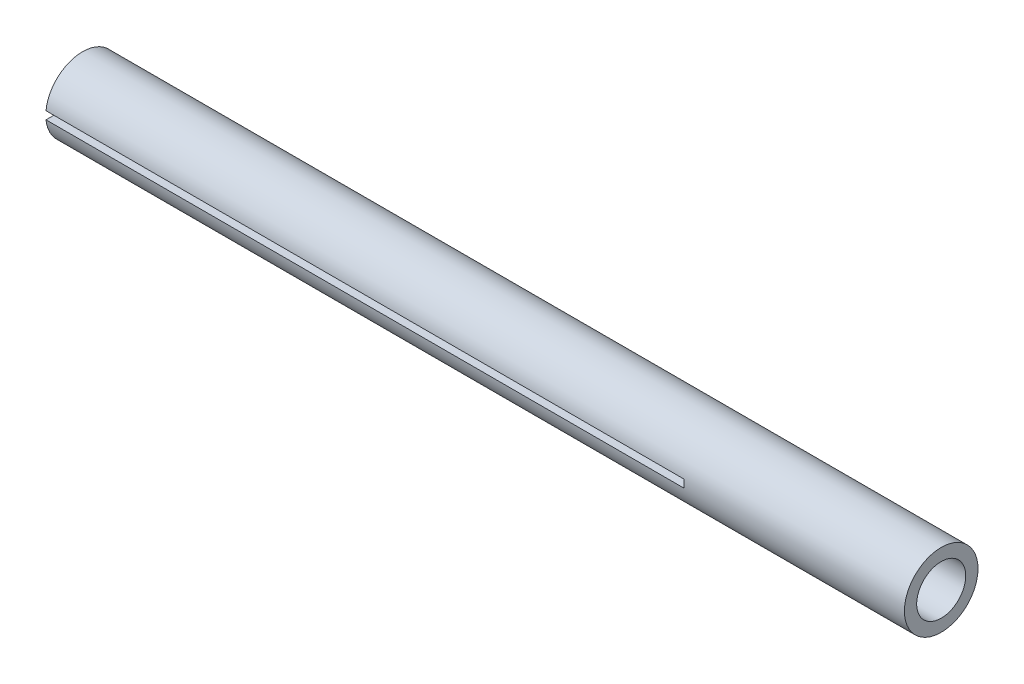
ISO-10303-21;
HEADER;
FILE_DESCRIPTION(('STEP AP214'),'2;1');
FILE_NAME('part.step','',(''),(''),'','','');
FILE_SCHEMA(('AUTOMOTIVE_DESIGN { 1 0 10303 214 1 1 1 1 }'));
ENDSEC;
DATA;
#1=APPLICATION_CONTEXT('core data for automotive mechanical design processes');
#2=APPLICATION_PROTOCOL_DEFINITION('international standard','automotive_design',2000,#1);
#3=PRODUCT_CONTEXT('',#1,'mechanical');
#4=PRODUCT('Part','Part','',(#3));
#5=PRODUCT_RELATED_PRODUCT_CATEGORY('part','',(#4));
#6=PRODUCT_DEFINITION_FORMATION('','',#4);
#7=PRODUCT_DEFINITION_CONTEXT('part definition',#1,'design');
#8=PRODUCT_DEFINITION('design','',#6,#7);
#9=PRODUCT_DEFINITION_SHAPE('','',#8);
#10=(LENGTH_UNIT() NAMED_UNIT(*) SI_UNIT(.MILLI.,.METRE.));
#11=(NAMED_UNIT(*) PLANE_ANGLE_UNIT() SI_UNIT($,.RADIAN.));
#12=(NAMED_UNIT(*) SI_UNIT($,.STERADIAN.) SOLID_ANGLE_UNIT());
#13=UNCERTAINTY_MEASURE_WITH_UNIT(LENGTH_MEASURE(1.E-05),#10,'distance_accuracy_value','');
#14=(GEOMETRIC_REPRESENTATION_CONTEXT(3) GLOBAL_UNCERTAINTY_ASSIGNED_CONTEXT((#13)) GLOBAL_UNIT_ASSIGNED_CONTEXT((#10,
#11,#12)) REPRESENTATION_CONTEXT('',''));
#15=CARTESIAN_POINT('',(0.,0.,0.));
#16=DIRECTION('',(0.,0.,1.));
#17=DIRECTION('',(1.,0.,0.));
#18=AXIS2_PLACEMENT_3D('',#15,#16,#17);
#19=CARTESIAN_POINT('',(0.,15.0494836321337,37.2907559026321));
#20=DIRECTION('',(1.,0.,0.));
#21=DIRECTION('',(0.,0.,-1.));
#22=AXIS2_PLACEMENT_3D('',#19,#20,#21);
#23=PLANE('',#22);
#24=DIRECTION('',(0.,0.,-1.));
#25=VECTOR('',#24,1.);
#26=CARTESIAN_POINT('',(0.,14.8462836321337,47.5777559026321));
#27=LINE('',#26,#25);
#28=CARTESIAN_POINT('',(0.,14.8462836321337,36.03711729442));
#29=VERTEX_POINT('',#28);
#30=CARTESIAN_POINT('',(0.,14.8462836321337,35.3966242387819));
#31=VERTEX_POINT('',#30);
#32=EDGE_CURVE('E152',#29,#31,#27,.T.);
#33=ORIENTED_EDGE('',*,*,#32,.T.);
#34=CARTESIAN_POINT('',(0.,15.0494836321337,37.2907559026321));
#35=DIRECTION('',(1.,0.,0.));
#36=DIRECTION('',(0.,0.,-1.));
#37=AXIS2_PLACEMENT_3D('',#34,#35,#36);
#38=CIRCLE('',#37,1.90500000000001);
#39=CARTESIAN_POINT('',(0.,14.8462836321337,39.1848875664824));
#40=VERTEX_POINT('',#39);
#41=EDGE_CURVE('E122',#40,#31,#38,.T.);
#42=ORIENTED_EDGE('',*,*,#41,.F.);
#43=CARTESIAN_POINT('',(0.,14.8462836321337,38.5443945108442));
#44=VERTEX_POINT('',#43);
#45=EDGE_CURVE('E156',#40,#44,#27,.T.);
#46=ORIENTED_EDGE('',*,*,#45,.T.);
#47=CARTESIAN_POINT('',(0.,15.0494836321337,37.2907559026321));
#48=DIRECTION('',(1.,0.,0.));
#49=DIRECTION('',(0.,0.,-1.));
#50=AXIS2_PLACEMENT_3D('',#47,#48,#49);
#51=CIRCLE('',#50,1.27);
#52=EDGE_CURVE('E167',#44,#29,#51,.T.);
#53=ORIENTED_EDGE('',*,*,#52,.T.);
#54=EDGE_LOOP('',(#33,#42,#46,#53));
#55=FACE_BOUND('',#54,.T.);
#56=ADVANCED_FACE('F34',(#55),#23,.F.);
#57=DIRECTION('',(0.,0.,-1.));
#58=VECTOR('',#57,1.);
#59=CARTESIAN_POINT('',(0.,15.2526836321337,47.5777559026321));
#60=LINE('',#59,#58);
#61=CARTESIAN_POINT('',(0.,15.2526836321337,39.1848875664824));
#62=VERTEX_POINT('',#61);
#63=CARTESIAN_POINT('',(0.,15.2526836321337,38.5443945108442));
#64=VERTEX_POINT('',#63);
#65=EDGE_CURVE('E57',#62,#64,#60,.T.);
#66=ORIENTED_EDGE('',*,*,#65,.F.);
#67=CARTESIAN_POINT('',(0.,15.2526836321337,35.3966242387819));
#68=VERTEX_POINT('',#67);
#69=EDGE_CURVE('E113',#68,#62,#38,.T.);
#70=ORIENTED_EDGE('',*,*,#69,.F.);
#71=CARTESIAN_POINT('',(0.,15.2526836321337,36.03711729442));
#72=VERTEX_POINT('',#71);
#73=EDGE_CURVE('E116',#72,#68,#60,.T.);
#74=ORIENTED_EDGE('',*,*,#73,.F.);
#75=EDGE_CURVE('E115',#72,#64,#51,.T.);
#76=ORIENTED_EDGE('',*,*,#75,.T.);
#77=EDGE_LOOP('',(#66,#70,#74,#76));
#78=FACE_BOUND('',#77,.T.);
#79=ADVANCED_FACE('F111',(#78),#23,.F.);
#80=CARTESIAN_POINT('',(44.45,15.0494836321337,37.2907559026321));
#81=DIRECTION('',(-1.,0.,0.));
#82=DIRECTION('',(0.,0.,1.));
#83=AXIS2_PLACEMENT_3D('',#80,#81,#82);
#84=CYLINDRICAL_SURFACE('',#83,1.90500000000001);
#85=CARTESIAN_POINT('',(44.45,15.0494836321337,37.2907559026321));
#86=DIRECTION('',(1.,0.,0.));
#87=DIRECTION('',(0.,0.,-1.));
#88=AXIS2_PLACEMENT_3D('',#85,#86,#87);
#89=CIRCLE('',#88,1.90500000000001);
#90=CARTESIAN_POINT('',(44.45,15.0494836321337,35.3857559026321));
#91=VERTEX_POINT('',#90);
#92=EDGE_CURVE('E121',#91,#91,#89,.T.);
#93=ORIENTED_EDGE('',*,*,#92,.F.);
#94=EDGE_LOOP('',(#93));
#95=FACE_BOUND('',#94,.T.);
#96=DIRECTION('',(-1.,0.,0.));
#97=VECTOR('',#96,1.);
#98=CARTESIAN_POINT('',(44.45,14.8462836321337,39.1848875664824));
#99=LINE('',#98,#97);
#100=CARTESIAN_POINT('',(33.0324608621808,14.8462836321337,39.1848875664824));
#101=VERTEX_POINT('',#100);
#102=EDGE_CURVE('E151',#40,#101,#99,.F.);
#103=ORIENTED_EDGE('',*,*,#102,.F.);
#104=ORIENTED_EDGE('',*,*,#41,.T.);
#105=DIRECTION('',(-1.,0.,0.));
#106=VECTOR('',#105,1.);
#107=CARTESIAN_POINT('',(44.45,14.8462836321337,35.3966242387819));
#108=LINE('',#107,#106);
#109=CARTESIAN_POINT('',(33.0324608621808,14.8462836321337,35.3966242387819));
#110=VERTEX_POINT('',#109);
#111=EDGE_CURVE('E165',#110,#31,#108,.T.);
#112=ORIENTED_EDGE('',*,*,#111,.F.);
#113=CARTESIAN_POINT('',(33.0324608621808,15.0494836321337,37.2907559026321));
#114=DIRECTION('',(-1.,0.,0.));
#115=DIRECTION('',(0.,0.,1.));
#116=AXIS2_PLACEMENT_3D('',#113,#114,#115);
#117=CIRCLE('',#116,1.90500000000001);
#118=CARTESIAN_POINT('',(33.0324608621808,15.2526836321337,35.3966242387819));
#119=VERTEX_POINT('',#118);
#120=EDGE_CURVE('E163',#119,#110,#117,.T.);
#121=ORIENTED_EDGE('',*,*,#120,.F.);
#122=DIRECTION('',(-1.,0.,0.));
#123=VECTOR('',#122,1.);
#124=CARTESIAN_POINT('',(44.45,15.2526836321337,35.3966242387819));
#125=LINE('',#124,#123);
#126=EDGE_CURVE('E106',#68,#119,#125,.F.);
#127=ORIENTED_EDGE('',*,*,#126,.F.);
#128=ORIENTED_EDGE('',*,*,#69,.T.);
#129=DIRECTION('',(-1.,0.,0.));
#130=VECTOR('',#129,1.);
#131=CARTESIAN_POINT('',(44.45,15.2526836321337,39.1848875664824));
#132=LINE('',#131,#130);
#133=CARTESIAN_POINT('',(33.0324608621808,15.2526836321337,39.1848875664824));
#134=VERTEX_POINT('',#133);
#135=EDGE_CURVE('E98',#134,#62,#132,.T.);
#136=ORIENTED_EDGE('',*,*,#135,.F.);
#137=EDGE_CURVE('E105',#101,#134,#117,.T.);
#138=ORIENTED_EDGE('',*,*,#137,.F.);
#139=EDGE_LOOP('',(#103,#104,#112,#121,#127,#128,#136,#138));
#140=FACE_BOUND('',#139,.T.);
#141=ADVANCED_FACE('F36',(#95,#140),#84,.T.);
#142=CARTESIAN_POINT('',(44.45,15.0494836321337,37.2907559026321));
#143=DIRECTION('',(-1.,0.,0.));
#144=DIRECTION('',(0.,0.,1.));
#145=AXIS2_PLACEMENT_3D('',#142,#143,#144);
#146=CYLINDRICAL_SURFACE('',#145,1.27);
#147=CARTESIAN_POINT('',(44.45,15.0494836321337,37.2907559026321));
#148=DIRECTION('',(1.,0.,0.));
#149=DIRECTION('',(0.,0.,-1.));
#150=AXIS2_PLACEMENT_3D('',#147,#148,#149);
#151=CIRCLE('',#150,1.27);
#152=CARTESIAN_POINT('',(44.45,15.0494836321337,36.0207559026321));
#153=VERTEX_POINT('',#152);
#154=EDGE_CURVE('E128',#153,#153,#151,.T.);
#155=ORIENTED_EDGE('',*,*,#154,.T.);
#156=EDGE_LOOP('',(#155));
#157=FACE_BOUND('',#156,.T.);
#158=ORIENTED_EDGE('',*,*,#52,.F.);
#159=DIRECTION('',(-1.,0.,0.));
#160=VECTOR('',#159,1.);
#161=CARTESIAN_POINT('',(44.45,14.8462836321337,38.5443945108442));
#162=LINE('',#161,#160);
#163=CARTESIAN_POINT('',(33.0324608621808,14.8462836321337,38.5443945108442));
#164=VERTEX_POINT('',#163);
#165=EDGE_CURVE('E11',#44,#164,#162,.F.);
#166=ORIENTED_EDGE('',*,*,#165,.T.);
#167=CARTESIAN_POINT('',(33.0324608621808,15.0494836321337,37.2907559026321));
#168=DIRECTION('',(-1.,0.,0.));
#169=DIRECTION('',(0.,0.,1.));
#170=AXIS2_PLACEMENT_3D('',#167,#168,#169);
#171=CIRCLE('',#170,1.27);
#172=CARTESIAN_POINT('',(33.0324608621808,15.2526836321337,38.5443945108442));
#173=VERTEX_POINT('',#172);
#174=EDGE_CURVE('E42',#164,#173,#171,.T.);
#175=ORIENTED_EDGE('',*,*,#174,.T.);
#176=DIRECTION('',(-1.,0.,0.));
#177=VECTOR('',#176,1.);
#178=CARTESIAN_POINT('',(44.45,15.2526836321337,38.5443945108442));
#179=LINE('',#178,#177);
#180=EDGE_CURVE('E138',#173,#64,#179,.T.);
#181=ORIENTED_EDGE('',*,*,#180,.T.);
#182=ORIENTED_EDGE('',*,*,#75,.F.);
#183=DIRECTION('',(-1.,0.,0.));
#184=VECTOR('',#183,1.);
#185=CARTESIAN_POINT('',(44.45,15.2526836321337,36.03711729442));
#186=LINE('',#185,#184);
#187=CARTESIAN_POINT('',(33.0324608621808,15.2526836321337,36.03711729442));
#188=VERTEX_POINT('',#187);
#189=EDGE_CURVE('E125',#72,#188,#186,.F.);
#190=ORIENTED_EDGE('',*,*,#189,.T.);
#191=CARTESIAN_POINT('',(33.0324608621808,14.8462836321337,36.03711729442));
#192=VERTEX_POINT('',#191);
#193=EDGE_CURVE('E133',#188,#192,#171,.T.);
#194=ORIENTED_EDGE('',*,*,#193,.T.);
#195=DIRECTION('',(-1.,0.,0.));
#196=VECTOR('',#195,1.);
#197=CARTESIAN_POINT('',(44.45,14.8462836321337,36.03711729442));
#198=LINE('',#197,#196);
#199=EDGE_CURVE('E136',#192,#29,#198,.T.);
#200=ORIENTED_EDGE('',*,*,#199,.T.);
#201=EDGE_LOOP('',(#158,#166,#175,#181,#182,#190,#194,#200));
#202=FACE_BOUND('',#201,.T.);
#203=ADVANCED_FACE('F142',(#157,#202),#146,.F.);
#204=CARTESIAN_POINT('',(44.45,15.0494836321337,37.2907559026321));
#205=DIRECTION('',(1.,0.,0.));
#206=DIRECTION('',(0.,0.,-1.));
#207=AXIS2_PLACEMENT_3D('',#204,#205,#206);
#208=PLANE('',#207);
#209=ORIENTED_EDGE('',*,*,#92,.T.);
#210=EDGE_LOOP('',(#209));
#211=FACE_BOUND('',#210,.T.);
#212=ORIENTED_EDGE('',*,*,#154,.F.);
#213=EDGE_LOOP('',(#212));
#214=FACE_BOUND('',#213,.T.);
#215=ADVANCED_FACE('F180',(#211,#214),#208,.T.);
#216=CARTESIAN_POINT('',(0.,15.2526836321337,47.5777559026321));
#217=DIRECTION('',(0.,-1.,0.));
#218=DIRECTION('',(0.,0.,-1.));
#219=AXIS2_PLACEMENT_3D('',#216,#217,#218);
#220=PLANE('',#219);
#221=ORIENTED_EDGE('',*,*,#126,.T.);
#222=DIRECTION('',(0.,0.,-1.));
#223=VECTOR('',#222,1.);
#224=CARTESIAN_POINT('',(33.0324608621808,15.2526836321337,47.5777559026321));
#225=LINE('',#224,#223);
#226=EDGE_CURVE('E49',#188,#119,#225,.T.);
#227=ORIENTED_EDGE('',*,*,#226,.F.);
#228=ORIENTED_EDGE('',*,*,#189,.F.);
#229=ORIENTED_EDGE('',*,*,#73,.T.);
#230=EDGE_LOOP('',(#221,#227,#228,#229));
#231=FACE_BOUND('',#230,.T.);
#232=ADVANCED_FACE('F178',(#231),#220,.T.);
#233=CARTESIAN_POINT('',(33.0324608621808,15.0072697135215,47.5777559026321));
#234=DIRECTION('',(-1.,0.,0.));
#235=DIRECTION('',(0.,0.,1.));
#236=AXIS2_PLACEMENT_3D('',#233,#234,#235);
#237=PLANE('',#236);
#238=ORIENTED_EDGE('',*,*,#120,.T.);
#239=DIRECTION('',(0.,0.,-1.));
#240=VECTOR('',#239,1.);
#241=CARTESIAN_POINT('',(33.0324608621808,14.8462836321337,47.5777559026321));
#242=LINE('',#241,#240);
#243=EDGE_CURVE('E153',#192,#110,#242,.T.);
#244=ORIENTED_EDGE('',*,*,#243,.F.);
#245=ORIENTED_EDGE('',*,*,#193,.F.);
#246=ORIENTED_EDGE('',*,*,#226,.T.);
#247=EDGE_LOOP('',(#238,#244,#245,#246));
#248=FACE_BOUND('',#247,.T.);
#249=ADVANCED_FACE('F177',(#248),#237,.T.);
#250=CARTESIAN_POINT('',(0.,14.8462836321337,47.5777559026321));
#251=DIRECTION('',(0.,1.,0.));
#252=DIRECTION('',(0.,0.,1.));
#253=AXIS2_PLACEMENT_3D('',#250,#251,#252);
#254=PLANE('',#253);
#255=ORIENTED_EDGE('',*,*,#111,.T.);
#256=ORIENTED_EDGE('',*,*,#32,.F.);
#257=ORIENTED_EDGE('',*,*,#199,.F.);
#258=ORIENTED_EDGE('',*,*,#243,.T.);
#259=EDGE_LOOP('',(#255,#256,#257,#258));
#260=FACE_BOUND('',#259,.T.);
#261=ADVANCED_FACE('F174',(#260),#254,.T.);
#262=ORIENTED_EDGE('',*,*,#102,.T.);
#263=EDGE_CURVE('E147',#101,#164,#242,.T.);
#264=ORIENTED_EDGE('',*,*,#263,.T.);
#265=ORIENTED_EDGE('',*,*,#165,.F.);
#266=ORIENTED_EDGE('',*,*,#45,.F.);
#267=EDGE_LOOP('',(#262,#264,#265,#266));
#268=FACE_BOUND('',#267,.T.);
#269=ADVANCED_FACE('F149',(#268),#254,.T.);
#270=ORIENTED_EDGE('',*,*,#137,.T.);
#271=EDGE_CURVE('E101',#134,#173,#225,.T.);
#272=ORIENTED_EDGE('',*,*,#271,.T.);
#273=ORIENTED_EDGE('',*,*,#174,.F.);
#274=ORIENTED_EDGE('',*,*,#263,.F.);
#275=EDGE_LOOP('',(#270,#272,#273,#274));
#276=FACE_BOUND('',#275,.T.);
#277=ADVANCED_FACE('F146',(#276),#237,.T.);
#278=ORIENTED_EDGE('',*,*,#135,.T.);
#279=ORIENTED_EDGE('',*,*,#65,.T.);
#280=ORIENTED_EDGE('',*,*,#180,.F.);
#281=ORIENTED_EDGE('',*,*,#271,.F.);
#282=EDGE_LOOP('',(#278,#279,#280,#281));
#283=FACE_BOUND('',#282,.T.);
#284=ADVANCED_FACE('F99',(#283),#220,.T.);
#285=CLOSED_SHELL('',(#56,#79,#141,#203,#215,#232,#249,#261,#269,#277,#284));
#286=MANIFOLD_SOLID_BREP('B2',#285);
#287=ADVANCED_BREP_SHAPE_REPRESENTATION('',(#18,#286),#14);
#288=SHAPE_DEFINITION_REPRESENTATION(#9,#287);
ENDSEC;
END-ISO-10303-21;
